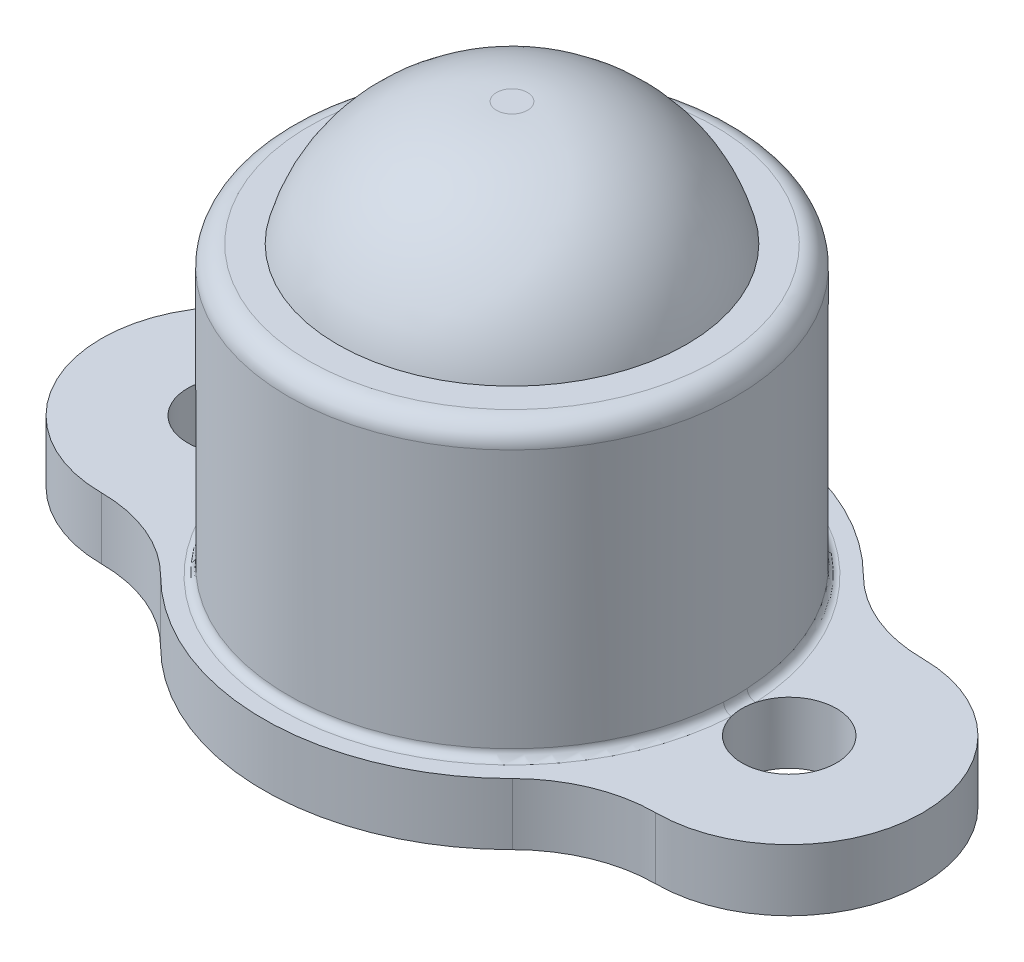
ISO-10303-21;
HEADER;
FILE_DESCRIPTION(('STEP AP214'),'2;1');
FILE_NAME('part.step','',(''),(''),'','','');
FILE_SCHEMA(('AUTOMOTIVE_DESIGN { 1 0 10303 214 1 1 1 1 }'));
ENDSEC;
DATA;
#1=APPLICATION_CONTEXT('core data for automotive mechanical design processes');
#2=APPLICATION_PROTOCOL_DEFINITION('international standard','automotive_design',2000,#1);
#3=PRODUCT_CONTEXT('',#1,'mechanical');
#4=PRODUCT('Part','Part','',(#3));
#5=PRODUCT_RELATED_PRODUCT_CATEGORY('part','',(#4));
#6=PRODUCT_DEFINITION_FORMATION('','',#4);
#7=PRODUCT_DEFINITION_CONTEXT('part definition',#1,'design');
#8=PRODUCT_DEFINITION('design','',#6,#7);
#9=PRODUCT_DEFINITION_SHAPE('','',#8);
#10=(LENGTH_UNIT() NAMED_UNIT(*) SI_UNIT(.MILLI.,.METRE.));
#11=(NAMED_UNIT(*) PLANE_ANGLE_UNIT() SI_UNIT($,.RADIAN.));
#12=(NAMED_UNIT(*) SI_UNIT($,.STERADIAN.) SOLID_ANGLE_UNIT());
#13=UNCERTAINTY_MEASURE_WITH_UNIT(LENGTH_MEASURE(1.E-05),#10,'distance_accuracy_value','');
#14=(GEOMETRIC_REPRESENTATION_CONTEXT(3) GLOBAL_UNCERTAINTY_ASSIGNED_CONTEXT((#13)) GLOBAL_UNIT_ASSIGNED_CONTEXT((#10,
#11,#12)) REPRESENTATION_CONTEXT('',''));
#15=CARTESIAN_POINT('',(0.,0.,0.));
#16=DIRECTION('',(0.,0.,1.));
#17=DIRECTION('',(1.,0.,0.));
#18=AXIS2_PLACEMENT_3D('',#15,#16,#17);
#19=CARTESIAN_POINT('',(0.,8.5,0.));
#20=DIRECTION('',(0.,1.,0.));
#21=DIRECTION('',(0.,0.,1.));
#22=AXIS2_PLACEMENT_3D('',#19,#20,#21);
#23=PLANE('',#22);
#24=CARTESIAN_POINT('',(0.,8.5,0.));
#25=DIRECTION('',(0.,1.,0.));
#26=DIRECTION('',(0.,0.,1.));
#27=AXIS2_PLACEMENT_3D('',#24,#25,#26);
#28=CIRCLE('',#27,4.94689619894046);
#29=CARTESIAN_POINT('',(0.,8.5,4.94689619894046));
#30=VERTEX_POINT('',#29);
#31=EDGE_CURVE('E158',#30,#30,#28,.T.);
#32=ORIENTED_EDGE('',*,*,#31,.T.);
#33=EDGE_LOOP('',(#32));
#34=FACE_BOUND('',#33,.T.);
#35=CARTESIAN_POINT('',(0.,8.5,0.));
#36=DIRECTION('',(0.,1.,0.));
#37=DIRECTION('',(0.,0.,1.));
#38=AXIS2_PLACEMENT_3D('',#35,#36,#37);
#39=CIRCLE('',#38,4.25);
#40=CARTESIAN_POINT('',(0.,8.5,4.25));
#41=VERTEX_POINT('',#40);
#42=EDGE_CURVE('E214',#41,#41,#39,.T.);
#43=ORIENTED_EDGE('',*,*,#42,.F.);
#44=EDGE_LOOP('',(#43));
#45=FACE_BOUND('',#44,.T.);
#46=ADVANCED_FACE('F37',(#34,#45),#23,.T.);
#47=CARTESIAN_POINT('',(0.,1.5,0.));
#48=DIRECTION('',(0.,1.,0.));
#49=DIRECTION('',(0.,0.,1.));
#50=AXIS2_PLACEMENT_3D('',#47,#48,#49);
#51=PLANE('',#50);
#52=CARTESIAN_POINT('',(6.75,1.5,-6.73616071428572));
#53=DIRECTION('',(0.,1.,0.));
#54=DIRECTION('',(0.,0.,1.));
#55=AXIS2_PLACEMENT_3D('',#52,#53,#54);
#56=CIRCLE('',#55,3.48616071428572);
#57=CARTESIAN_POINT('',(6.75,1.5,-3.25));
#58=VERTEX_POINT('',#57);
#59=CARTESIAN_POINT('',(4.28238378353073,1.5,-4.27360376386873));
#60=VERTEX_POINT('',#59);
#61=EDGE_CURVE('E141',#58,#60,#56,.F.);
#62=ORIENTED_EDGE('',*,*,#61,.T.);
#63=CARTESIAN_POINT('',(0.,1.5,0.));
#64=DIRECTION('',(0.,1.,0.));
#65=DIRECTION('',(0.,0.,1.));
#66=AXIS2_PLACEMENT_3D('',#63,#64,#65);
#67=CIRCLE('',#66,6.05);
#68=CARTESIAN_POINT('',(-4.28238378353073,1.5,-4.27360376386873));
#69=VERTEX_POINT('',#68);
#70=EDGE_CURVE('E129',#60,#69,#67,.T.);
#71=ORIENTED_EDGE('',*,*,#70,.T.);
#72=CARTESIAN_POINT('',(-6.75,1.5,-6.73616071428572));
#73=DIRECTION('',(0.,1.,0.));
#74=DIRECTION('',(0.,0.,1.));
#75=AXIS2_PLACEMENT_3D('',#72,#73,#74);
#76=CIRCLE('',#75,3.48616071428572);
#77=CARTESIAN_POINT('',(-6.75,1.5,-3.25));
#78=VERTEX_POINT('',#77);
#79=EDGE_CURVE('E140',#78,#69,#76,.T.);
#80=ORIENTED_EDGE('',*,*,#79,.F.);
#81=CARTESIAN_POINT('',(-6.75,1.5,0.));
#82=DIRECTION('',(0.,1.,0.));
#83=DIRECTION('',(0.,0.,1.));
#84=AXIS2_PLACEMENT_3D('',#81,#82,#83);
#85=CIRCLE('',#84,3.25);
#86=CARTESIAN_POINT('',(-6.75,1.5,3.25));
#87=VERTEX_POINT('',#86);
#88=EDGE_CURVE('E350',#78,#87,#85,.T.);
#89=ORIENTED_EDGE('',*,*,#88,.T.);
#90=CARTESIAN_POINT('',(-6.75,1.5,6.73616071428572));
#91=DIRECTION('',(0.,1.,0.));
#92=DIRECTION('',(0.,0.,1.));
#93=AXIS2_PLACEMENT_3D('',#90,#91,#92);
#94=CIRCLE('',#93,3.48616071428572);
#95=CARTESIAN_POINT('',(-4.28238378353073,1.5,4.27360376386873));
#96=VERTEX_POINT('',#95);
#97=EDGE_CURVE('E369',#87,#96,#94,.F.);
#98=ORIENTED_EDGE('',*,*,#97,.T.);
#99=CARTESIAN_POINT('',(0.,1.5,0.));
#100=DIRECTION('',(0.,1.,0.));
#101=DIRECTION('',(0.,0.,1.));
#102=AXIS2_PLACEMENT_3D('',#99,#100,#101);
#103=CIRCLE('',#102,6.05);
#104=CARTESIAN_POINT('',(4.28238378353073,1.5,4.27360376386874));
#105=VERTEX_POINT('',#104);
#106=EDGE_CURVE('E366',#96,#105,#103,.T.);
#107=ORIENTED_EDGE('',*,*,#106,.T.);
#108=CARTESIAN_POINT('',(6.75,1.5,6.73616071428572));
#109=DIRECTION('',(0.,1.,0.));
#110=DIRECTION('',(0.,0.,1.));
#111=AXIS2_PLACEMENT_3D('',#108,#109,#110);
#112=CIRCLE('',#111,3.48616071428572);
#113=CARTESIAN_POINT('',(6.75,1.5,3.25));
#114=VERTEX_POINT('',#113);
#115=EDGE_CURVE('E365',#114,#105,#112,.T.);
#116=ORIENTED_EDGE('',*,*,#115,.F.);
#117=CARTESIAN_POINT('',(6.75,1.5,0.));
#118=DIRECTION('',(0.,1.,0.));
#119=DIRECTION('',(0.,0.,1.));
#120=AXIS2_PLACEMENT_3D('',#117,#118,#119);
#121=CIRCLE('',#120,3.25);
#122=EDGE_CURVE('E148',#58,#114,#121,.F.);
#123=ORIENTED_EDGE('',*,*,#122,.F.);
#124=EDGE_LOOP('',(#62,#71,#80,#89,#98,#107,#116,#123));
#125=FACE_BOUND('',#124,.T.);
#126=CARTESIAN_POINT('',(-6.75,1.5,0.));
#127=DIRECTION('',(0.,1.,0.));
#128=DIRECTION('',(0.,0.,1.));
#129=AXIS2_PLACEMENT_3D('',#126,#127,#128);
#130=CIRCLE('',#129,1.15);
#131=CARTESIAN_POINT('',(-5.63906938382283,1.5,-0.297208960228696));
#132=VERTEX_POINT('',#131);
#133=CARTESIAN_POINT('',(-5.63906938382283,1.5,0.297208960228696));
#134=VERTEX_POINT('',#133);
#135=EDGE_CURVE('E376',#132,#134,#130,.T.);
#136=ORIENTED_EDGE('',*,*,#135,.F.);
#137=CARTESIAN_POINT('',(0.,1.5,0.));
#138=DIRECTION('',(0.,1.,0.));
#139=DIRECTION('',(0.,0.,1.));
#140=AXIS2_PLACEMENT_3D('',#137,#138,#139);
#141=CIRCLE('',#140,5.64689619894046);
#142=CARTESIAN_POINT('',(5.63906938382283,1.5,-0.297208960228695));
#143=VERTEX_POINT('',#142);
#144=EDGE_CURVE('E11',#132,#143,#141,.F.);
#145=ORIENTED_EDGE('',*,*,#144,.T.);
#146=CARTESIAN_POINT('',(6.75,1.5,0.));
#147=DIRECTION('',(0.,1.,0.));
#148=DIRECTION('',(0.,0.,-1.));
#149=AXIS2_PLACEMENT_3D('',#146,#147,#148);
#150=CIRCLE('',#149,1.15);
#151=CARTESIAN_POINT('',(5.63906938382283,1.5,0.297208960228699));
#152=VERTEX_POINT('',#151);
#153=EDGE_CURVE('E57',#152,#143,#150,.T.);
#154=ORIENTED_EDGE('',*,*,#153,.F.);
#155=CARTESIAN_POINT('',(0.,1.5,0.));
#156=DIRECTION('',(0.,1.,0.));
#157=DIRECTION('',(0.,0.,1.));
#158=AXIS2_PLACEMENT_3D('',#155,#156,#157);
#159=CIRCLE('',#158,5.64689619894046);
#160=EDGE_CURVE('E50',#152,#134,#159,.F.);
#161=ORIENTED_EDGE('',*,*,#160,.T.);
#162=EDGE_LOOP('',(#136,#145,#154,#161));
#163=FACE_BOUND('',#162,.T.);
#164=ADVANCED_FACE('F145',(#125,#163),#51,.T.);
#165=CARTESIAN_POINT('',(6.75,1.5,-6.73616071428572));
#166=DIRECTION('',(0.,-1.,0.));
#167=DIRECTION('',(0.,0.,-1.));
#168=AXIS2_PLACEMENT_3D('',#165,#166,#167);
#169=CYLINDRICAL_SURFACE('',#168,3.48616071428572);
#170=CARTESIAN_POINT('',(6.75,0.,-6.73616071428572));
#171=DIRECTION('',(0.,1.,0.));
#172=DIRECTION('',(0.,0.,1.));
#173=AXIS2_PLACEMENT_3D('',#170,#171,#172);
#174=CIRCLE('',#173,3.48616071428572);
#175=CARTESIAN_POINT('',(6.75,0.,-3.25));
#176=VERTEX_POINT('',#175);
#177=CARTESIAN_POINT('',(4.28238378353073,0.,-4.27360376386873));
#178=VERTEX_POINT('',#177);
#179=EDGE_CURVE('E154',#176,#178,#174,.F.);
#180=ORIENTED_EDGE('',*,*,#179,.T.);
#181=DIRECTION('',(0.,-1.,0.));
#182=VECTOR('',#181,1.);
#183=CARTESIAN_POINT('',(4.28238378353073,1.5,-4.27360376386873));
#184=LINE('',#183,#182);
#185=EDGE_CURVE('E134',#60,#178,#184,.T.);
#186=ORIENTED_EDGE('',*,*,#185,.F.);
#187=ORIENTED_EDGE('',*,*,#61,.F.);
#188=DIRECTION('',(0.,-1.,0.));
#189=VECTOR('',#188,1.);
#190=CARTESIAN_POINT('',(6.75,1.5,-3.25));
#191=LINE('',#190,#189);
#192=EDGE_CURVE('E328',#58,#176,#191,.T.);
#193=ORIENTED_EDGE('',*,*,#192,.T.);
#194=EDGE_LOOP('',(#180,#186,#187,#193));
#195=FACE_BOUND('',#194,.T.);
#196=ADVANCED_FACE('F152',(#195),#169,.F.);
#197=CARTESIAN_POINT('',(0.,1.5,0.));
#198=DIRECTION('',(0.,-1.,0.));
#199=DIRECTION('',(0.,0.,-1.));
#200=AXIS2_PLACEMENT_3D('',#197,#198,#199);
#201=CYLINDRICAL_SURFACE('',#200,6.05);
#202=CARTESIAN_POINT('',(0.,0.,0.));
#203=DIRECTION('',(0.,1.,0.));
#204=DIRECTION('',(0.,0.,1.));
#205=AXIS2_PLACEMENT_3D('',#202,#203,#204);
#206=CIRCLE('',#205,6.05);
#207=CARTESIAN_POINT('',(-4.28238378353073,0.,-4.27360376386873));
#208=VERTEX_POINT('',#207);
#209=EDGE_CURVE('E326',#178,#208,#206,.T.);
#210=ORIENTED_EDGE('',*,*,#209,.T.);
#211=DIRECTION('',(0.,-1.,0.));
#212=VECTOR('',#211,1.);
#213=CARTESIAN_POINT('',(-4.28238378353073,1.5,-4.27360376386873));
#214=LINE('',#213,#212);
#215=EDGE_CURVE('E136',#69,#208,#214,.T.);
#216=ORIENTED_EDGE('',*,*,#215,.F.);
#217=ORIENTED_EDGE('',*,*,#70,.F.);
#218=ORIENTED_EDGE('',*,*,#185,.T.);
#219=EDGE_LOOP('',(#210,#216,#217,#218));
#220=FACE_BOUND('',#219,.T.);
#221=ADVANCED_FACE('F132',(#220),#201,.T.);
#222=CARTESIAN_POINT('',(-6.75,1.5,-6.73616071428572));
#223=DIRECTION('',(0.,-1.,0.));
#224=DIRECTION('',(0.,0.,-1.));
#225=AXIS2_PLACEMENT_3D('',#222,#223,#224);
#226=CYLINDRICAL_SURFACE('',#225,3.48616071428572);
#227=CARTESIAN_POINT('',(-6.75,0.,-6.73616071428572));
#228=DIRECTION('',(0.,1.,0.));
#229=DIRECTION('',(0.,0.,1.));
#230=AXIS2_PLACEMENT_3D('',#227,#228,#229);
#231=CIRCLE('',#230,3.48616071428572);
#232=CARTESIAN_POINT('',(-6.75,0.,-3.25));
#233=VERTEX_POINT('',#232);
#234=EDGE_CURVE('E353',#233,#208,#231,.T.);
#235=ORIENTED_EDGE('',*,*,#234,.F.);
#236=DIRECTION('',(0.,-1.,0.));
#237=VECTOR('',#236,1.);
#238=CARTESIAN_POINT('',(-6.75,1.5,-3.25));
#239=LINE('',#238,#237);
#240=EDGE_CURVE('E160',#78,#233,#239,.T.);
#241=ORIENTED_EDGE('',*,*,#240,.F.);
#242=ORIENTED_EDGE('',*,*,#79,.T.);
#243=ORIENTED_EDGE('',*,*,#215,.T.);
#244=EDGE_LOOP('',(#235,#241,#242,#243));
#245=FACE_BOUND('',#244,.T.);
#246=ADVANCED_FACE('F281',(#245),#226,.F.);
#247=CARTESIAN_POINT('',(-6.75,1.5,0.));
#248=DIRECTION('',(0.,-1.,0.));
#249=DIRECTION('',(0.,0.,-1.));
#250=AXIS2_PLACEMENT_3D('',#247,#248,#249);
#251=CYLINDRICAL_SURFACE('',#250,3.25);
#252=CARTESIAN_POINT('',(-6.75,0.,0.));
#253=DIRECTION('',(0.,1.,0.));
#254=DIRECTION('',(0.,0.,1.));
#255=AXIS2_PLACEMENT_3D('',#252,#253,#254);
#256=CIRCLE('',#255,3.25);
#257=CARTESIAN_POINT('',(-6.75,0.,3.25));
#258=VERTEX_POINT('',#257);
#259=EDGE_CURVE('E349',#233,#258,#256,.T.);
#260=ORIENTED_EDGE('',*,*,#259,.T.);
#261=DIRECTION('',(0.,-1.,0.));
#262=VECTOR('',#261,1.);
#263=CARTESIAN_POINT('',(-6.75,1.5,3.25));
#264=LINE('',#263,#262);
#265=EDGE_CURVE('E344',#87,#258,#264,.T.);
#266=ORIENTED_EDGE('',*,*,#265,.F.);
#267=ORIENTED_EDGE('',*,*,#88,.F.);
#268=ORIENTED_EDGE('',*,*,#240,.T.);
#269=EDGE_LOOP('',(#260,#266,#267,#268));
#270=FACE_BOUND('',#269,.T.);
#271=ADVANCED_FACE('F284',(#270),#251,.T.);
#272=CARTESIAN_POINT('',(-6.75,1.5,6.73616071428572));
#273=DIRECTION('',(0.,-1.,0.));
#274=DIRECTION('',(0.,0.,-1.));
#275=AXIS2_PLACEMENT_3D('',#272,#273,#274);
#276=CYLINDRICAL_SURFACE('',#275,3.48616071428572);
#277=CARTESIAN_POINT('',(-6.75,0.,6.73616071428572));
#278=DIRECTION('',(0.,1.,0.));
#279=DIRECTION('',(0.,0.,1.));
#280=AXIS2_PLACEMENT_3D('',#277,#278,#279);
#281=CIRCLE('',#280,3.48616071428572);
#282=CARTESIAN_POINT('',(-4.28238378353073,0.,4.27360376386873));
#283=VERTEX_POINT('',#282);
#284=EDGE_CURVE('E355',#258,#283,#281,.F.);
#285=ORIENTED_EDGE('',*,*,#284,.T.);
#286=DIRECTION('',(0.,-1.,0.));
#287=VECTOR('',#286,1.);
#288=CARTESIAN_POINT('',(-4.28238378353073,1.5,4.27360376386873));
#289=LINE('',#288,#287);
#290=EDGE_CURVE('E341',#96,#283,#289,.T.);
#291=ORIENTED_EDGE('',*,*,#290,.F.);
#292=ORIENTED_EDGE('',*,*,#97,.F.);
#293=ORIENTED_EDGE('',*,*,#265,.T.);
#294=EDGE_LOOP('',(#285,#291,#292,#293));
#295=FACE_BOUND('',#294,.T.);
#296=ADVANCED_FACE('F288',(#295),#276,.F.);
#297=CARTESIAN_POINT('',(0.,1.5,0.));
#298=DIRECTION('',(0.,-1.,0.));
#299=DIRECTION('',(0.,0.,-1.));
#300=AXIS2_PLACEMENT_3D('',#297,#298,#299);
#301=CYLINDRICAL_SURFACE('',#300,6.05);
#302=CARTESIAN_POINT('',(0.,0.,0.));
#303=DIRECTION('',(0.,1.,0.));
#304=DIRECTION('',(0.,0.,1.));
#305=AXIS2_PLACEMENT_3D('',#302,#303,#304);
#306=CIRCLE('',#305,6.05);
#307=CARTESIAN_POINT('',(4.28238378353073,0.,4.27360376386874));
#308=VERTEX_POINT('',#307);
#309=EDGE_CURVE('E333',#283,#308,#306,.T.);
#310=ORIENTED_EDGE('',*,*,#309,.T.);
#311=DIRECTION('',(0.,-1.,0.));
#312=VECTOR('',#311,1.);
#313=CARTESIAN_POINT('',(4.28238378353073,1.5,4.27360376386874));
#314=LINE('',#313,#312);
#315=EDGE_CURVE('E339',#105,#308,#314,.T.);
#316=ORIENTED_EDGE('',*,*,#315,.F.);
#317=ORIENTED_EDGE('',*,*,#106,.F.);
#318=ORIENTED_EDGE('',*,*,#290,.T.);
#319=EDGE_LOOP('',(#310,#316,#317,#318));
#320=FACE_BOUND('',#319,.T.);
#321=ADVANCED_FACE('F292',(#320),#301,.T.);
#322=CARTESIAN_POINT('',(6.75,1.5,6.73616071428572));
#323=DIRECTION('',(0.,-1.,0.));
#324=DIRECTION('',(0.,0.,-1.));
#325=AXIS2_PLACEMENT_3D('',#322,#323,#324);
#326=CYLINDRICAL_SURFACE('',#325,3.48616071428572);
#327=CARTESIAN_POINT('',(6.75,0.,6.73616071428572));
#328=DIRECTION('',(0.,1.,0.));
#329=DIRECTION('',(0.,0.,1.));
#330=AXIS2_PLACEMENT_3D('',#327,#328,#329);
#331=CIRCLE('',#330,3.48616071428572);
#332=CARTESIAN_POINT('',(6.75,0.,3.25));
#333=VERTEX_POINT('',#332);
#334=EDGE_CURVE('E331',#333,#308,#331,.T.);
#335=ORIENTED_EDGE('',*,*,#334,.F.);
#336=DIRECTION('',(0.,-1.,0.));
#337=VECTOR('',#336,1.);
#338=CARTESIAN_POINT('',(6.75,1.5,3.25));
#339=LINE('',#338,#337);
#340=EDGE_CURVE('E329',#114,#333,#339,.T.);
#341=ORIENTED_EDGE('',*,*,#340,.F.);
#342=ORIENTED_EDGE('',*,*,#115,.T.);
#343=ORIENTED_EDGE('',*,*,#315,.T.);
#344=EDGE_LOOP('',(#335,#341,#342,#343));
#345=FACE_BOUND('',#344,.T.);
#346=ADVANCED_FACE('F275',(#345),#326,.F.);
#347=CARTESIAN_POINT('',(0.,1.5,0.));
#348=DIRECTION('',(0.,-1.,0.));
#349=DIRECTION('',(0.,0.,-1.));
#350=AXIS2_PLACEMENT_3D('',#347,#348,#349);
#351=CYLINDRICAL_SURFACE('',#350,2.94689619894046);
#352=CARTESIAN_POINT('',(0.,0.,0.));
#353=DIRECTION('',(0.,1.,0.));
#354=DIRECTION('',(0.,0.,1.));
#355=AXIS2_PLACEMENT_3D('',#352,#353,#354);
#356=CIRCLE('',#355,2.94689619894046);
#357=CARTESIAN_POINT('',(0.,0.,2.94689619894046));
#358=VERTEX_POINT('',#357);
#359=EDGE_CURVE('E321',#358,#358,#356,.T.);
#360=ORIENTED_EDGE('',*,*,#359,.F.);
#361=EDGE_LOOP('',(#360));
#362=FACE_BOUND('',#361,.T.);
#363=CARTESIAN_POINT('',(0.,8.5,0.));
#364=DIRECTION('',(0.,1.,0.));
#365=DIRECTION('',(0.,0.,1.));
#366=AXIS2_PLACEMENT_3D('',#363,#364,#365);
#367=CIRCLE('',#366,2.94689619894046);
#368=CARTESIAN_POINT('',(0.,8.5,2.94689619894046));
#369=VERTEX_POINT('',#368);
#370=EDGE_CURVE('E385',#369,#369,#367,.F.);
#371=ORIENTED_EDGE('',*,*,#370,.F.);
#372=EDGE_LOOP('',(#371));
#373=FACE_BOUND('',#372,.T.);
#374=ADVANCED_FACE('F271',(#362,#373),#351,.F.);
#375=CARTESIAN_POINT('',(6.75,1.5,0.));
#376=DIRECTION('',(0.,-1.,0.));
#377=DIRECTION('',(0.,0.,-1.));
#378=AXIS2_PLACEMENT_3D('',#375,#376,#377);
#379=CYLINDRICAL_SURFACE('',#378,3.25);
#380=CARTESIAN_POINT('',(6.75,0.,0.));
#381=DIRECTION('',(0.,1.,0.));
#382=DIRECTION('',(0.,0.,1.));
#383=AXIS2_PLACEMENT_3D('',#380,#381,#382);
#384=CIRCLE('',#383,3.25);
#385=EDGE_CURVE('E150',#176,#333,#384,.F.);
#386=ORIENTED_EDGE('',*,*,#385,.F.);
#387=ORIENTED_EDGE('',*,*,#192,.F.);
#388=ORIENTED_EDGE('',*,*,#122,.T.);
#389=ORIENTED_EDGE('',*,*,#340,.T.);
#390=EDGE_LOOP('',(#386,#387,#388,#389));
#391=FACE_BOUND('',#390,.T.);
#392=ADVANCED_FACE('F274',(#391),#379,.T.);
#393=CARTESIAN_POINT('',(0.,0.,0.));
#394=DIRECTION('',(0.,1.,0.));
#395=DIRECTION('',(0.,0.,1.));
#396=AXIS2_PLACEMENT_3D('',#393,#394,#395);
#397=PLANE('',#396);
#398=CARTESIAN_POINT('',(6.75,0.,0.));
#399=DIRECTION('',(0.,1.,0.));
#400=DIRECTION('',(0.,0.,-1.));
#401=AXIS2_PLACEMENT_3D('',#398,#399,#400);
#402=CIRCLE('',#401,1.15);
#403=CARTESIAN_POINT('',(6.75,0.,-1.15));
#404=VERTEX_POINT('',#403);
#405=EDGE_CURVE('E313',#404,#404,#402,.T.);
#406=ORIENTED_EDGE('',*,*,#405,.T.);
#407=EDGE_LOOP('',(#406));
#408=FACE_BOUND('',#407,.T.);
#409=CARTESIAN_POINT('',(-6.75,0.,0.));
#410=DIRECTION('',(0.,1.,0.));
#411=DIRECTION('',(0.,0.,1.));
#412=AXIS2_PLACEMENT_3D('',#409,#410,#411);
#413=CIRCLE('',#412,1.15);
#414=CARTESIAN_POINT('',(-6.75,0.,1.15));
#415=VERTEX_POINT('',#414);
#416=EDGE_CURVE('E317',#415,#415,#413,.T.);
#417=ORIENTED_EDGE('',*,*,#416,.T.);
#418=EDGE_LOOP('',(#417));
#419=FACE_BOUND('',#418,.T.);
#420=ORIENTED_EDGE('',*,*,#359,.T.);
#421=EDGE_LOOP('',(#420));
#422=FACE_BOUND('',#421,.T.);
#423=ORIENTED_EDGE('',*,*,#179,.F.);
#424=ORIENTED_EDGE('',*,*,#385,.T.);
#425=ORIENTED_EDGE('',*,*,#334,.T.);
#426=ORIENTED_EDGE('',*,*,#309,.F.);
#427=ORIENTED_EDGE('',*,*,#284,.F.);
#428=ORIENTED_EDGE('',*,*,#259,.F.);
#429=ORIENTED_EDGE('',*,*,#234,.T.);
#430=ORIENTED_EDGE('',*,*,#209,.F.);
#431=EDGE_LOOP('',(#423,#424,#425,#426,#427,#428,#429,#430));
#432=FACE_BOUND('',#431,.T.);
#433=ADVANCED_FACE('F301',(#408,#419,#422,#432),#397,.F.);
#434=CARTESIAN_POINT('',(-6.75,0.,0.));
#435=DIRECTION('',(0.,1.,0.));
#436=DIRECTION('',(0.,0.,1.));
#437=AXIS2_PLACEMENT_3D('',#434,#435,#436);
#438=CYLINDRICAL_SURFACE('',#437,1.15);
#439=ORIENTED_EDGE('',*,*,#416,.F.);
#440=EDGE_LOOP('',(#439));
#441=FACE_BOUND('',#440,.T.);
#442=EDGE_CURVE('E373',#134,#132,#130,.T.);
#443=ORIENTED_EDGE('',*,*,#442,.T.);
#444=ORIENTED_EDGE('',*,*,#135,.T.);
#445=EDGE_LOOP('',(#443,#444));
#446=FACE_BOUND('',#445,.T.);
#447=ADVANCED_FACE('F304',(#441,#446),#438,.F.);
#448=CARTESIAN_POINT('',(6.75,0.,0.));
#449=DIRECTION('',(0.,1.,0.));
#450=DIRECTION('',(0.,0.,1.));
#451=AXIS2_PLACEMENT_3D('',#448,#449,#450);
#452=CYLINDRICAL_SURFACE('',#451,1.15);
#453=ORIENTED_EDGE('',*,*,#405,.F.);
#454=EDGE_LOOP('',(#453));
#455=FACE_BOUND('',#454,.T.);
#456=EDGE_CURVE('E379',#143,#152,#150,.T.);
#457=ORIENTED_EDGE('',*,*,#456,.T.);
#458=ORIENTED_EDGE('',*,*,#153,.T.);
#459=EDGE_LOOP('',(#457,#458));
#460=FACE_BOUND('',#459,.T.);
#461=ADVANCED_FACE('F207',(#455,#460),#452,.F.);
#462=CARTESIAN_POINT('',(0.,8.5,0.));
#463=DIRECTION('',(0.,-1.,0.));
#464=DIRECTION('',(0.,0.,-1.));
#465=AXIS2_PLACEMENT_3D('',#462,#463,#464);
#466=CYLINDRICAL_SURFACE('',#465,5.44689619894046);
#467=CARTESIAN_POINT('',(0.,1.7,0.));
#468=DIRECTION('',(0.,1.,0.));
#469=DIRECTION('',(0.,0.,1.));
#470=AXIS2_PLACEMENT_3D('',#467,#468,#469);
#471=CIRCLE('',#470,5.44689619894046);
#472=CARTESIAN_POINT('',(5.43934659150797,1.7,-0.286682506412013));
#473=VERTEX_POINT('',#472);
#474=CARTESIAN_POINT('',(-5.43934659150797,1.7,-0.286682506412014));
#475=VERTEX_POINT('',#474);
#476=EDGE_CURVE('E169',#473,#475,#471,.T.);
#477=ORIENTED_EDGE('',*,*,#476,.T.);
#478=CARTESIAN_POINT('',(-5.4235190524168,1.67727950532013,-0.504102459926552));
#479=CARTESIAN_POINT('',(-5.43070076971012,1.38173068395291,-0.426836063378881));
#480=CARTESIAN_POINT('',(-5.70665870784337,1.5,-0.483672356126479));
#481=CARTESIAN_POINT('',(-5.42565670047543,1.68349660454197,-0.481133907770004));
#482=CARTESIAN_POINT('',(-5.43077758593432,1.40030054344534,-0.422785831983225));
#483=CARTESIAN_POINT('',(-5.69861394321352,1.5,-0.466340194467271));
#484=CARTESIAN_POINT('',(-5.42767190245897,1.68804159533558,-0.457841524957272));
#485=CARTESIAN_POINT('',(-5.4314133194152,1.41739954765745,-0.413082637502617));
#486=CARTESIAN_POINT('',(-5.69062529798567,1.5,-0.447955237972466));
#487=CARTESIAN_POINT('',(-5.43141644634372,1.69466154986054,-0.411015851769007));
#488=CARTESIAN_POINT('',(-5.43321072082022,1.44693869633108,-0.386709889490867));
#489=CARTESIAN_POINT('',(-5.67515611943556,1.5,-0.409430970072772));
#490=CARTESIAN_POINT('',(-5.43314718513049,1.69674891409758,-0.387484380400831));
#491=CARTESIAN_POINT('',(-5.43434641607273,1.45978690391992,-0.370374319266718));
#492=CARTESIAN_POINT('',(-5.6676732163382,1.5,-0.389301021264652));
#493=CARTESIAN_POINT('',(-5.436296465662,1.69936639289213,-0.340463082000713));
#494=CARTESIAN_POINT('',(-5.43667402711847,1.48132474589723,-0.334066370717892));
#495=CARTESIAN_POINT('',(-5.65355701806841,1.5,-0.347558740185773));
#496=CARTESIAN_POINT('',(-5.43771648220679,1.69990401806429,-0.316973607369686));
#497=CARTESIAN_POINT('',(-5.43787219246013,1.49030815119144,-0.314135680125248));
#498=CARTESIAN_POINT('',(-5.64691977474829,1.5,-0.32595407868118));
#499=CARTESIAN_POINT('',(-5.44025380746517,1.70007183865785,-0.269946475588933));
#500=CARTESIAN_POINT('',(-5.44013197073995,1.50520363305062,-0.272158347935737));
#501=CARTESIAN_POINT('',(-5.63470825495002,1.5,-0.281356226855839));
#502=CARTESIAN_POINT('',(-5.44137069480515,1.69970077803812,-0.246408796731536));
#503=CARTESIAN_POINT('',(-5.44120751119222,1.51128205486146,-0.250012717699331));
#504=CARTESIAN_POINT('',(-5.62913546129458,1.5,-0.258361157467956));
#505=CARTESIAN_POINT('',(-5.44438895542486,1.69800246416573,-0.172711044394734));
#506=CARTESIAN_POINT('',(-5.44412624741176,1.52641658596099,-0.179904297475389));
#507=CARTESIAN_POINT('',(-5.61375895444039,1.5,-0.184579689991734));
#508=CARTESIAN_POINT('',(-5.44574922762309,1.69606842507223,-0.122544571571133));
#509=CARTESIAN_POINT('',(-5.44565302713678,1.53222494947881,-0.127718757035615));
#510=CARTESIAN_POINT('',(-5.60629701360133,1.5,-0.131771189064923));
#511=CARTESIAN_POINT('',(-5.4470826655772,1.69419736932644,-0.0221141700457301));
#512=CARTESIAN_POINT('',(-5.44708845993309,1.53772004130409,-0.0237107684340233));
#513=CARTESIAN_POINT('',(-5.59899381467766,1.5,-0.0241448204670984));
#514=CARTESIAN_POINT('',(-5.44705494559254,1.69426162786828,0.0281498004180865));
#515=CARTESIAN_POINT('',(-5.44705187402875,1.53761514605763,0.0300601375778517));
#516=CARTESIAN_POINT('',(-5.59915742279594,1.5,0.0306743079822824));
#517=CARTESIAN_POINT('',(-5.44585282717895,1.69590751173711,0.111699660513613));
#518=CARTESIAN_POINT('',(-5.44577169114925,1.53265830027411,0.116193551686797));
#519=CARTESIAN_POINT('',(-5.60572220288123,1.5,0.120103340723799));
#520=CARTESIAN_POINT('',(-5.44506761030572,1.69697101862934,0.145004489002799));
#521=CARTESIAN_POINT('',(-5.44491600277162,1.52932846321708,0.150561810792077));
#522=CARTESIAN_POINT('',(-5.61000489866518,1.5,0.155303699041868));
#523=CARTESIAN_POINT('',(-5.44288769489912,1.69893698759419,0.211565392156619));
#524=CARTESIAN_POINT('',(-5.44268280077241,1.51909984428065,0.216865509301681));
#525=CARTESIAN_POINT('',(-5.62144768616225,1.5,0.223764409386533));
#526=CARTESIAN_POINT('',(-5.44149356699263,1.69983959933351,0.244821483288501));
#527=CARTESIAN_POINT('',(-5.44127053755381,1.51200627952832,0.249291005262641));
#528=CARTESIAN_POINT('',(-5.62860508341158,1.5,0.257026544776273));
#529=CARTESIAN_POINT('',(-5.43802602422379,1.70012895819966,0.312644013203008));
#530=CARTESIAN_POINT('',(-5.43809297757347,1.4922433284701,0.311217541045197));
#531=CARTESIAN_POINT('',(-5.64551843114877,1.5,0.322175983666487));
#532=CARTESIAN_POINT('',(-5.43592818098061,1.69945505616225,0.347210845199417));
#533=CARTESIAN_POINT('',(-5.43627242919409,1.47890204316493,0.340843188836098));
#534=CARTESIAN_POINT('',(-5.65536504140039,1.5,0.353958682421364));
#535=CARTESIAN_POINT('',(-5.43229337658369,1.69563935087287,0.39895826896801));
#536=CARTESIAN_POINT('',(-5.43382528608136,1.45359612938084,0.377928153949843));
#537=CARTESIAN_POINT('',(-5.67134292976575,1.5,0.399069076214963));
#538=CARTESIAN_POINT('',(-5.43099611414659,1.69389111200626,0.416238486233691));
#539=CARTESIAN_POINT('',(-5.43303065136548,1.44383410349031,0.389396877801614));
#540=CARTESIAN_POINT('',(-5.67688744723624,1.5,0.413715959964618));
#541=CARTESIAN_POINT('',(-5.42824919789447,1.6890873776212,0.45065485982982));
#542=CARTESIAN_POINT('',(-5.43169468429337,1.42216613033548,0.408913191964405));
#543=CARTESIAN_POINT('',(-5.68824545937749,1.5,0.442054160900243));
#544=CARTESIAN_POINT('',(-5.42679918564396,1.68602875325999,0.467790570618371));
#545=CARTESIAN_POINT('',(-5.43116277696528,1.41010003330895,0.416837076051408));
#546=CARTESIAN_POINT('',(-5.69405956793639,1.5,0.455743099178282));
#547=CARTESIAN_POINT('',(-5.42528087508953,1.68213576970775,0.484773790978742));
#548=CARTESIAN_POINT('',(-5.43088708762353,1.39722410217698,0.422032615179994));
#549=CARTESIAN_POINT('',(-5.69993058563361,1.5,0.468886153572735));
#550=(BOUNDED_SURFACE() B_SPLINE_SURFACE(3,2,((#478,#479,#480),(#481,#482,#483),(#484,#485,
#486),(#487,#488,#489),(#490,#491,#492),(#493,#494,#495),(#496,#497,#498),(#499,#500,#501),
(#502,#503,#504),(#505,#506,#507),(#508,#509,#510),(#511,#512,#513),(#514,#515,#516),(#517,#518,
#519),(#520,#521,#522),(#523,#524,#525),(#526,#527,#528),(#529,#530,#531),(#532,#533,#534),
(#535,#536,#537),(#538,#539,#540),(#541,#542,#543),(#544,#545,#546),(#547,#548,#549)),
.UNSPECIFIED.,.F.,.F.,.F.) B_SPLINE_SURFACE_WITH_KNOTS((4,2,2,2,2,2,2,2,2,2,2,4),(3,3),(0.,
0.0739169850604639,0.147459384915979,0.220644766623378,0.293931366730879,0.450091476461137,
0.606351240285779,0.710004724929268,0.813561280827954,0.921166828611147,0.975273297223309,
1.02950968370675),(0.,1.),
.UNSPECIFIED.) GEOMETRIC_REPRESENTATION_ITEM() RATIONAL_B_SPLINE_SURFACE(((1.,0.547645661999465,
1.),(1.,0.56913384705998,1.),(1.,0.589331579400989,1.),(1.,0.626883842775,1.),(1.,
0.644252263450306,1.),(1.,0.67602738129211,1.),(1.,0.690448047087672,1.),(1.,0.716374570277887,
1.),(1.,0.72787636878846,1.),(1.,0.759133473871642,1.),(1.,0.773514150520819,1.),(1.,
0.78760584786103,1.),(1.,0.787307501205851,1.),(1.,0.774611694589233,1.),(1.,0.766321326248267,
1.),(1.,0.74356339039567,1.),(1.,0.729101606573853,1.),(1.,0.693573380360763,1.),(1.,
0.672270808810171,1.),(1.,0.635677192002064,1.),(1.,0.62266304031043,1.),(1.,0.595125650644278,
1.),(1.,0.580598864157281,1.),(1.,0.56536316242677,1.))) REPRESENTATION_ITEM('') SURFACE());
#551=CARTESIAN_POINT('',(-5.4235190524168,1.67727950532013,-0.504102459926552));
#552=CARTESIAN_POINT('',(-5.42565670047543,1.68349660454197,-0.481133907770004));
#553=CARTESIAN_POINT('',(-5.42767190245897,1.68804159533558,-0.457841524957272));
#554=CARTESIAN_POINT('',(-5.43141644634372,1.69466154986054,-0.411015851769007));
#555=CARTESIAN_POINT('',(-5.43314718513049,1.69674891409758,-0.387484380400831));
#556=CARTESIAN_POINT('',(-5.436296465662,1.69936639289213,-0.340463082000713));
#557=CARTESIAN_POINT('',(-5.43771648220679,1.69990401806429,-0.316973607369686));
#558=CARTESIAN_POINT('',(-5.44025380746517,1.70007183865785,-0.269946475588933));
#559=CARTESIAN_POINT('',(-5.44137069480515,1.69970077803812,-0.246408796731536));
#560=CARTESIAN_POINT('',(-5.44438895542486,1.69800246416573,-0.172711044394734));
#561=CARTESIAN_POINT('',(-5.44574922762309,1.69606842507223,-0.122544571571133));
#562=CARTESIAN_POINT('',(-5.4470826655772,1.69419736932644,-0.0221141700457301));
#563=CARTESIAN_POINT('',(-5.44705494559254,1.69426162786828,0.0281498004180865));
#564=CARTESIAN_POINT('',(-5.44585282717895,1.69590751173711,0.111699660513613));
#565=CARTESIAN_POINT('',(-5.44506761030572,1.69697101862934,0.145004489002799));
#566=CARTESIAN_POINT('',(-5.44288769489912,1.69893698759419,0.211565392156619));
#567=CARTESIAN_POINT('',(-5.44149356699263,1.69983959933351,0.244821483288501));
#568=CARTESIAN_POINT('',(-5.43802602422379,1.70012895819966,0.312644013203008));
#569=CARTESIAN_POINT('',(-5.43592818098061,1.69945505616225,0.347210845199417));
#570=CARTESIAN_POINT('',(-5.43229337658369,1.69563935087287,0.39895826896801));
#571=CARTESIAN_POINT('',(-5.43099611414659,1.69389111200626,0.416238486233691));
#572=CARTESIAN_POINT('',(-5.42824919789447,1.6890873776212,0.45065485982982));
#573=CARTESIAN_POINT('',(-5.42679918564396,1.68602875325999,0.467790570618371));
#574=CARTESIAN_POINT('',(-5.42528087508953,1.68213576970775,0.484773790978742));
#575=B_SPLINE_CURVE_WITH_KNOTS('',3,(#551,#552,#553,#554,#555,#556,#557,#558,#559,#560,#561,
#562,#563,#564,#565,#566,#567,#568,#569,#570,#571,#572,#573,#574),.UNSPECIFIED.,.F.,.F.,(4,2,2,
2,2,2,2,2,2,2,2,4),(0.,0.0739169850604639,0.147459384915979,0.220644766623378,0.293931366730879,
0.450091476461137,0.606351240285779,0.710004724929268,0.813561280827954,0.921166828611147,
0.975273297223309,1.02950968370675),.UNSPECIFIED.);
#576=CARTESIAN_POINT('',(-5.43934659150797,1.7,0.286682506412014));
#577=VERTEX_POINT('',#576);
#578=EDGE_CURVE('E401',#475,#577,#575,.T.);
#579=ORIENTED_EDGE('',*,*,#578,.T.);
#580=CARTESIAN_POINT('',(0.,1.7,0.));
#581=DIRECTION('',(0.,1.,0.));
#582=DIRECTION('',(0.,0.,1.));
#583=AXIS2_PLACEMENT_3D('',#580,#581,#582);
#584=CIRCLE('',#583,5.44689619894046);
#585=CARTESIAN_POINT('',(5.43934659150797,1.7,0.286682506412017));
#586=VERTEX_POINT('',#585);
#587=EDGE_CURVE('E179',#577,#586,#584,.T.);
#588=ORIENTED_EDGE('',*,*,#587,.T.);
#589=CARTESIAN_POINT('',(5.4235190524168,1.67727950532013,0.504102459926553));
#590=CARTESIAN_POINT('',(5.43070076970957,1.3817306839464,0.426836063384723));
#591=CARTESIAN_POINT('',(5.70665870784558,1.5,0.483672356131249));
#592=CARTESIAN_POINT('',(5.42565670047613,1.68349660454396,0.481133907762481));
#593=CARTESIAN_POINT('',(5.43077758593414,1.40030054344886,0.422785831984381));
#594=CARTESIAN_POINT('',(5.69861394321183,1.5,0.466340194463714));
#595=CARTESIAN_POINT('',(5.42767190246028,1.68804159533851,0.45784152494207));
#596=CARTESIAN_POINT('',(5.43141331941553,1.41739954766747,0.413082637497457));
#597=CARTESIAN_POINT('',(5.69062529798082,1.5,0.447955237961334));
#598=CARTESIAN_POINT('',(5.43141644634598,1.69466154986391,0.411015851739459));
#599=CARTESIAN_POINT('',(5.43321072082152,1.44693869634843,0.386709889472151));
#600=CARTESIAN_POINT('',(5.67515611942586,1.5,0.409430970047682));
#601=CARTESIAN_POINT('',(5.4331471851331,1.69674891410056,0.387484380364634));
#602=CARTESIAN_POINT('',(5.43434641607447,1.45978690393879,0.3703743192411));
#603=CARTESIAN_POINT('',(5.66767321632676,1.5,0.389301021233262));
#604=CARTESIAN_POINT('',(5.43629646566421,1.69936639289317,0.340463081964952));
#605=CARTESIAN_POINT('',(5.43667402712031,1.48132474591154,0.334066370687755));
#606=CARTESIAN_POINT('',(5.65355701805818,1.5,0.34755874015308));
#607=CARTESIAN_POINT('',(5.43771648220843,1.69990401806467,0.316973607341053));
#608=CARTESIAN_POINT('',(5.43787219246156,1.49030815120152,0.314135680100054));
#609=CARTESIAN_POINT('',(5.64691977474052,1.5,0.3259540786544));
#610=CARTESIAN_POINT('',(5.44025380746585,1.70007183865762,0.269946475574595));
#611=CARTESIAN_POINT('',(5.44013197074062,1.50520363305441,0.272158347921965));
#612=CARTESIAN_POINT('',(5.63470825494661,1.5,0.281356226841756));
#613=CARTESIAN_POINT('',(5.44137069480544,1.69970077803796,0.246408796724366));
#614=CARTESIAN_POINT('',(5.44120751119252,1.51128205486302,0.250012717692108));
#615=CARTESIAN_POINT('',(5.62913546129306,1.5,0.258361157460659));
#616=CARTESIAN_POINT('',(5.44438895542486,1.69800246416573,0.172711044394734));
#617=CARTESIAN_POINT('',(5.44412624741177,1.52641658596102,0.179904297475244));
#618=CARTESIAN_POINT('',(5.61375895444035,1.5,0.184579689991574));
#619=CARTESIAN_POINT('',(5.44574922762309,1.69606842507223,0.122544571571134));
#620=CARTESIAN_POINT('',(5.44565302713678,1.53222494947882,0.127718757035573));
#621=CARTESIAN_POINT('',(5.60629701360132,1.5,0.131771189064875));
#622=CARTESIAN_POINT('',(5.4470826655772,1.69419736932644,0.0221141700457313));
#623=CARTESIAN_POINT('',(5.44708845993309,1.53772004130409,0.0237107684340403));
#624=CARTESIAN_POINT('',(5.59899381467766,1.5,0.0241448204671189));
#625=CARTESIAN_POINT('',(5.44705494559254,1.69426162786828,-0.028149800418086));
#626=CARTESIAN_POINT('',(5.44705187402875,1.53761514605762,-0.0300601375778691));
#627=CARTESIAN_POINT('',(5.59915742279594,1.5,-0.0306743079823047));
#628=CARTESIAN_POINT('',(5.44585282717895,1.69590751173711,-0.111699660513613));
#629=CARTESIAN_POINT('',(5.44577169114925,1.53265830027411,-0.116193551686806));
#630=CARTESIAN_POINT('',(5.60572220288123,1.5,-0.12010334072381));
#631=CARTESIAN_POINT('',(5.44506761030572,1.69697101862934,-0.145004489002799));
#632=CARTESIAN_POINT('',(5.44491600277162,1.52932846321709,-0.150561810792066));
#633=CARTESIAN_POINT('',(5.61000489866518,1.5,-0.155303699041853));
#634=CARTESIAN_POINT('',(5.44288769489912,1.69893698759419,-0.211565392156619));
#635=CARTESIAN_POINT('',(5.44268280077241,1.51909984428066,-0.216865509301665));
#636=CARTESIAN_POINT('',(5.62144768616225,1.5,-0.223764409386516));
#637=CARTESIAN_POINT('',(5.44149356699263,1.69983959933351,-0.244821483288501));
#638=CARTESIAN_POINT('',(5.44127053755381,1.51200627952832,-0.249291005262645));
#639=CARTESIAN_POINT('',(5.62860508341159,1.5,-0.257026544776279));
#640=CARTESIAN_POINT('',(5.43802602422379,1.70012895819966,-0.312644013203008));
#641=CARTESIAN_POINT('',(5.43809297757348,1.49224332847012,-0.311217541045161));
#642=CARTESIAN_POINT('',(5.64551843114876,1.5,-0.32217598366645));
#643=CARTESIAN_POINT('',(5.43592818098061,1.69945505616225,-0.347210845199416));
#644=CARTESIAN_POINT('',(5.4362724291941,1.47890204316498,-0.340843188835987));
#645=CARTESIAN_POINT('',(5.65536504140036,1.5,-0.353958682421259));
#646=CARTESIAN_POINT('',(5.43229337658369,1.69563935087287,-0.39895826896801));
#647=CARTESIAN_POINT('',(5.43382528608137,1.4535961293809,-0.377928153949739));
#648=CARTESIAN_POINT('',(5.67134292976572,1.5,-0.399069076214873));
#649=CARTESIAN_POINT('',(5.43099611414659,1.69389111200626,-0.416238486233691));
#650=CARTESIAN_POINT('',(5.43303065136549,1.44383410349036,-0.389396877801537));
#651=CARTESIAN_POINT('',(5.67688744723621,1.5,-0.413715959964553));
#652=CARTESIAN_POINT('',(5.42824919789447,1.6890873776212,-0.450654859829819));
#653=CARTESIAN_POINT('',(5.43169468429337,1.42216613033553,-0.40891319196435));
#654=CARTESIAN_POINT('',(5.68824545937747,1.5,-0.442054160900195));
#655=CARTESIAN_POINT('',(5.42679918564396,1.68602875325999,-0.46779057061837));
#656=CARTESIAN_POINT('',(5.43116277696528,1.41010003330902,-0.416837076051344));
#657=CARTESIAN_POINT('',(5.69405956793636,1.5,-0.455743099178227));
#658=CARTESIAN_POINT('',(5.42528087508953,1.68213576970775,-0.484773790978741));
#659=CARTESIAN_POINT('',(5.43088708762354,1.39722410217711,-0.422032615179852));
#660=CARTESIAN_POINT('',(5.69993058563356,1.5,-0.46888615357262));
#661=(BOUNDED_SURFACE() B_SPLINE_SURFACE(3,2,((#589,#590,#591),(#592,#593,#594),(#595,#596,
#597),(#598,#599,#600),(#601,#602,#603),(#604,#605,#606),(#607,#608,#609),(#610,#611,#612),
(#613,#614,#615),(#616,#617,#618),(#619,#620,#621),(#622,#623,#624),(#625,#626,#627),(#628,#629,
#630),(#631,#632,#633),(#634,#635,#636),(#637,#638,#639),(#640,#641,#642),(#643,#644,#645),
(#646,#647,#648),(#649,#650,#651),(#652,#653,#654),(#655,#656,#657),(#658,#659,#660)),
.UNSPECIFIED.,.F.,.F.,.F.) B_SPLINE_SURFACE_WITH_KNOTS((4,2,2,2,2,2,2,2,2,2,2,4),(3,3),(0.,
0.0739169850845046,0.147459384960486,0.220644766645665,0.293931366730846,0.450091476461102,
0.606351240285745,0.710004724929234,0.81356128082792,0.921166828611112,0.975273297223275,
1.02950968370672),(0.,1.),
.UNSPECIFIED.) GEOMETRIC_REPRESENTATION_ITEM() RATIONAL_B_SPLINE_SURFACE(((1.,0.547645661993433,
1.),(1.,0.569133847064472,1.),(1.,0.589331579413205,1.),(1.,0.626883842798106,1.),(1.,
0.644252263476721,1.),(1.,0.676027381314488,1.),(1.,0.690448047104371,1.),(1.,0.716374570284944,
1.),(1.,0.727876368791558,1.),(1.,0.759133473871699,1.),(1.,0.773514150520839,1.),(1.,
0.787605847861018,1.),(1.,0.787307501205842,1.),(1.,0.774611694589236,1.),(1.,0.766321326248276,
1.),(1.,0.743563390395671,1.),(1.,0.729101606573842,1.),(1.,0.69357338036079,1.),(1.,
0.672270808810252,1.),(1.,0.635677192002137,1.),(1.,0.622663040310486,1.),(1.,0.595125650644332,
1.),(1.,0.58059886415735,1.),(1.,0.565363162426903,1.))) REPRESENTATION_ITEM('') SURFACE());
#662=CARTESIAN_POINT('',(5.4235190524168,1.67727950532013,0.504102459926553));
#663=CARTESIAN_POINT('',(5.42565670047613,1.68349660454396,0.481133907762481));
#664=CARTESIAN_POINT('',(5.42767190246029,1.68804159533851,0.45784152494207));
#665=CARTESIAN_POINT('',(5.43141644634598,1.69466154986391,0.411015851739459));
#666=CARTESIAN_POINT('',(5.4331471851331,1.69674891410057,0.387484380364634));
#667=CARTESIAN_POINT('',(5.43629646566422,1.69936639289317,0.340463081964952));
#668=CARTESIAN_POINT('',(5.43771648220843,1.69990401806467,0.316973607341053));
#669=CARTESIAN_POINT('',(5.44025380746585,1.70007183865762,0.269946475574595));
#670=CARTESIAN_POINT('',(5.44137069480544,1.69970077803796,0.246408796724366));
#671=CARTESIAN_POINT('',(5.44438895542486,1.69800246416573,0.172711044394734));
#672=CARTESIAN_POINT('',(5.44574922762309,1.69606842507223,0.122544571571134));
#673=CARTESIAN_POINT('',(5.4470826655772,1.69419736932644,0.0221141700457312));
#674=CARTESIAN_POINT('',(5.44705494559254,1.69426162786828,-0.028149800418086));
#675=CARTESIAN_POINT('',(5.44585282717895,1.69590751173711,-0.111699660513613));
#676=CARTESIAN_POINT('',(5.44506761030572,1.69697101862934,-0.1450044890028));
#677=CARTESIAN_POINT('',(5.44288769489912,1.69893698759419,-0.211565392156619));
#678=CARTESIAN_POINT('',(5.44149356699263,1.69983959933351,-0.244821483288501));
#679=CARTESIAN_POINT('',(5.43802602422379,1.70012895819966,-0.312644013203008));
#680=CARTESIAN_POINT('',(5.43592818098061,1.69945505616225,-0.347210845199416));
#681=CARTESIAN_POINT('',(5.43229337658369,1.69563935087287,-0.39895826896801));
#682=CARTESIAN_POINT('',(5.43099611414659,1.69389111200626,-0.416238486233691));
#683=CARTESIAN_POINT('',(5.42824919789447,1.6890873776212,-0.450654859829819));
#684=CARTESIAN_POINT('',(5.42679918564396,1.68602875325999,-0.46779057061837));
#685=CARTESIAN_POINT('',(5.42528087508953,1.68213576970775,-0.484773790978741));
#686=B_SPLINE_CURVE_WITH_KNOTS('',3,(#662,#663,#664,#665,#666,#667,#668,#669,#670,#671,#672,
#673,#674,#675,#676,#677,#678,#679,#680,#681,#682,#683,#684,#685),.UNSPECIFIED.,.F.,.F.,(4,2,2,
2,2,2,2,2,2,2,2,4),(0.,0.0739169850845046,0.147459384960486,0.220644766645665,0.293931366730846,
0.450091476461102,0.606351240285745,0.710004724929234,0.81356128082792,0.921166828611112,
0.975273297223275,1.02950968370672),.UNSPECIFIED.);
#687=EDGE_CURVE('E171',#586,#473,#686,.T.);
#688=ORIENTED_EDGE('',*,*,#687,.T.);
#689=EDGE_LOOP('',(#477,#579,#588,#688));
#690=FACE_BOUND('',#689,.T.);
#691=CARTESIAN_POINT('',(0.,8.,0.));
#692=DIRECTION('',(0.,1.,0.));
#693=DIRECTION('',(0.,0.,1.));
#694=AXIS2_PLACEMENT_3D('',#691,#692,#693);
#695=CIRCLE('',#694,5.44689619894046);
#696=CARTESIAN_POINT('',(0.,8.,5.44689619894046));
#697=VERTEX_POINT('',#696);
#698=EDGE_CURVE('E166',#697,#697,#695,.F.);
#699=ORIENTED_EDGE('',*,*,#698,.T.);
#700=EDGE_LOOP('',(#699));
#701=FACE_BOUND('',#700,.T.);
#702=ADVANCED_FACE('F181',(#690,#701),#466,.T.);
#703=CARTESIAN_POINT('',(0.,11.5,0.));
#704=DIRECTION('',(0.,1.,0.));
#705=DIRECTION('',(0.,0.,1.));
#706=AXIS2_PLACEMENT_3D('',#703,#704,#705);
#707=PLANE('',#706);
#708=CARTESIAN_POINT('',(0.,11.5,0.));
#709=DIRECTION('',(0.,1.,0.));
#710=DIRECTION('',(0.,0.,1.));
#711=AXIS2_PLACEMENT_3D('',#708,#709,#710);
#712=CIRCLE('',#711,0.377016653792584);
#713=CARTESIAN_POINT('',(0.,11.5,0.377016653792584));
#714=VERTEX_POINT('',#713);
#715=EDGE_CURVE('E155',#714,#714,#712,.T.);
#716=ORIENTED_EDGE('',*,*,#715,.T.);
#717=EDGE_LOOP('',(#716));
#718=FACE_BOUND('',#717,.T.);
#719=ADVANCED_FACE('F253',(#718),#707,.T.);
#720=CARTESIAN_POINT('',(0.,8.5,0.));
#721=DIRECTION('',(0.,1.,0.));
#722=DIRECTION('',(0.,0.,1.));
#723=AXIS2_PLACEMENT_3D('',#720,#721,#722);
#724=PLANE('',#723);
#725=ORIENTED_EDGE('',*,*,#370,.T.);
#726=EDGE_LOOP('',(#725));
#727=FACE_BOUND('',#726,.T.);
#728=ADVANCED_FACE('F249',(#727),#724,.F.);
#729=CARTESIAN_POINT('',(0.,7.5,0.));
#730=DIRECTION('',(0.,-1.,0.));
#731=DIRECTION('',(0.,0.,-1.));
#732=AXIS2_PLACEMENT_3D('',#729,#730,#731);
#733=DEGENERATE_TOROIDAL_SURFACE('',#732,0.377016653792584,4.,.T.);
#734=ORIENTED_EDGE('',*,*,#42,.T.);
#735=EDGE_LOOP('',(#734));
#736=FACE_BOUND('',#735,.T.);
#737=ORIENTED_EDGE('',*,*,#715,.F.);
#738=EDGE_LOOP('',(#737));
#739=FACE_BOUND('',#738,.T.);
#740=ADVANCED_FACE('F252',(#736,#739),#733,.T.);
#741=CARTESIAN_POINT('',(0.,8.,0.));
#742=DIRECTION('',(0.,1.,0.));
#743=DIRECTION('',(0.,0.,1.));
#744=AXIS2_PLACEMENT_3D('',#741,#742,#743);
#745=TOROIDAL_SURFACE('',#744,4.94689619894046,0.5);
#746=ORIENTED_EDGE('',*,*,#698,.F.);
#747=EDGE_LOOP('',(#746));
#748=FACE_BOUND('',#747,.T.);
#749=ORIENTED_EDGE('',*,*,#31,.F.);
#750=EDGE_LOOP('',(#749));
#751=FACE_BOUND('',#750,.T.);
#752=ADVANCED_FACE('F189',(#748,#751),#745,.T.);
#753=CARTESIAN_POINT('',(5.63906938382283,1.7,0.297208960228699));
#754=DIRECTION('',(-0.0526322690834063,0.,0.998613961574307));
#755=DIRECTION('',(0.998613961574307,0.,0.0526322690834064));
#756=AXIS2_PLACEMENT_3D('',#753,#754,#755);
#757=CIRCLE('',#756,0.2);
#758=EDGE_CURVE('E215',#152,#586,#757,.F.);
#759=ORIENTED_EDGE('',*,*,#758,.F.);
#760=ORIENTED_EDGE('',*,*,#456,.F.);
#761=CARTESIAN_POINT('',(5.63906938382283,1.7,-0.297208960228695));
#762=DIRECTION('',(0.0526322690834057,0.,0.998613961574307));
#763=DIRECTION('',(0.998613961574307,0.,-0.0526322690834057));
#764=AXIS2_PLACEMENT_3D('',#761,#762,#763);
#765=CIRCLE('',#764,0.2);
#766=EDGE_CURVE('E211',#473,#143,#765,.T.);
#767=ORIENTED_EDGE('',*,*,#766,.F.);
#768=ORIENTED_EDGE('',*,*,#687,.F.);
#769=EDGE_LOOP('',(#759,#760,#767,#768));
#770=FACE_BOUND('',#769,.T.);
#771=ADVANCED_FACE('F193',(#770),#661,.F.);
#772=CARTESIAN_POINT('',(0.,1.7,0.));
#773=DIRECTION('',(0.,1.,0.));
#774=DIRECTION('',(0.,0.,1.));
#775=AXIS2_PLACEMENT_3D('',#772,#773,#774);
#776=TOROIDAL_SURFACE('',#775,5.64689619894046,0.2);
#777=ORIENTED_EDGE('',*,*,#766,.T.);
#778=ORIENTED_EDGE('',*,*,#144,.F.);
#779=CARTESIAN_POINT('',(-5.63906938382283,1.7,-0.297208960228696));
#780=DIRECTION('',(0.0526322690834056,0.,-0.998613961574307));
#781=DIRECTION('',(-0.998613961574307,0.,-0.0526322690834057));
#782=AXIS2_PLACEMENT_3D('',#779,#780,#781);
#783=CIRCLE('',#782,0.2);
#784=EDGE_CURVE('E218',#475,#132,#783,.T.);
#785=ORIENTED_EDGE('',*,*,#784,.F.);
#786=ORIENTED_EDGE('',*,*,#476,.F.);
#787=EDGE_LOOP('',(#777,#778,#785,#786));
#788=FACE_BOUND('',#787,.T.);
#789=ADVANCED_FACE('F198',(#788),#776,.F.);
#790=CARTESIAN_POINT('',(0.,1.7,0.));
#791=DIRECTION('',(0.,1.,0.));
#792=DIRECTION('',(0.,0.,1.));
#793=AXIS2_PLACEMENT_3D('',#790,#791,#792);
#794=TOROIDAL_SURFACE('',#793,5.64689619894046,0.2);
#795=ORIENTED_EDGE('',*,*,#758,.T.);
#796=ORIENTED_EDGE('',*,*,#587,.F.);
#797=CARTESIAN_POINT('',(-5.63906938382283,1.7,0.297208960228696));
#798=DIRECTION('',(0.0526322690834059,0.,0.998613961574307));
#799=DIRECTION('',(0.998613961574307,0.,-0.0526322690834059));
#800=AXIS2_PLACEMENT_3D('',#797,#798,#799);
#801=CIRCLE('',#800,0.2);
#802=EDGE_CURVE('E404',#134,#577,#801,.T.);
#803=ORIENTED_EDGE('',*,*,#802,.F.);
#804=ORIENTED_EDGE('',*,*,#160,.F.);
#805=EDGE_LOOP('',(#795,#796,#803,#804));
#806=FACE_BOUND('',#805,.T.);
#807=ADVANCED_FACE('F232',(#806),#794,.F.);
#808=ORIENTED_EDGE('',*,*,#784,.T.);
#809=ORIENTED_EDGE('',*,*,#442,.F.);
#810=ORIENTED_EDGE('',*,*,#802,.T.);
#811=ORIENTED_EDGE('',*,*,#578,.F.);
#812=EDGE_LOOP('',(#808,#809,#810,#811));
#813=FACE_BOUND('',#812,.T.);
#814=ADVANCED_FACE('F234',(#813),#550,.F.);
#815=CLOSED_SHELL('',(#46,#164,#196,#221,#246,#271,#296,#321,#346,#374,#392,#433,#447,#461,#702,
#719,#728,#740,#752,#771,#789,#807,#814));
#816=MANIFOLD_SOLID_BREP('B2',#815);
#817=ADVANCED_BREP_SHAPE_REPRESENTATION('',(#18,#816),#14);
#818=SHAPE_DEFINITION_REPRESENTATION(#9,#817);
ENDSEC;
END-ISO-10303-21;
